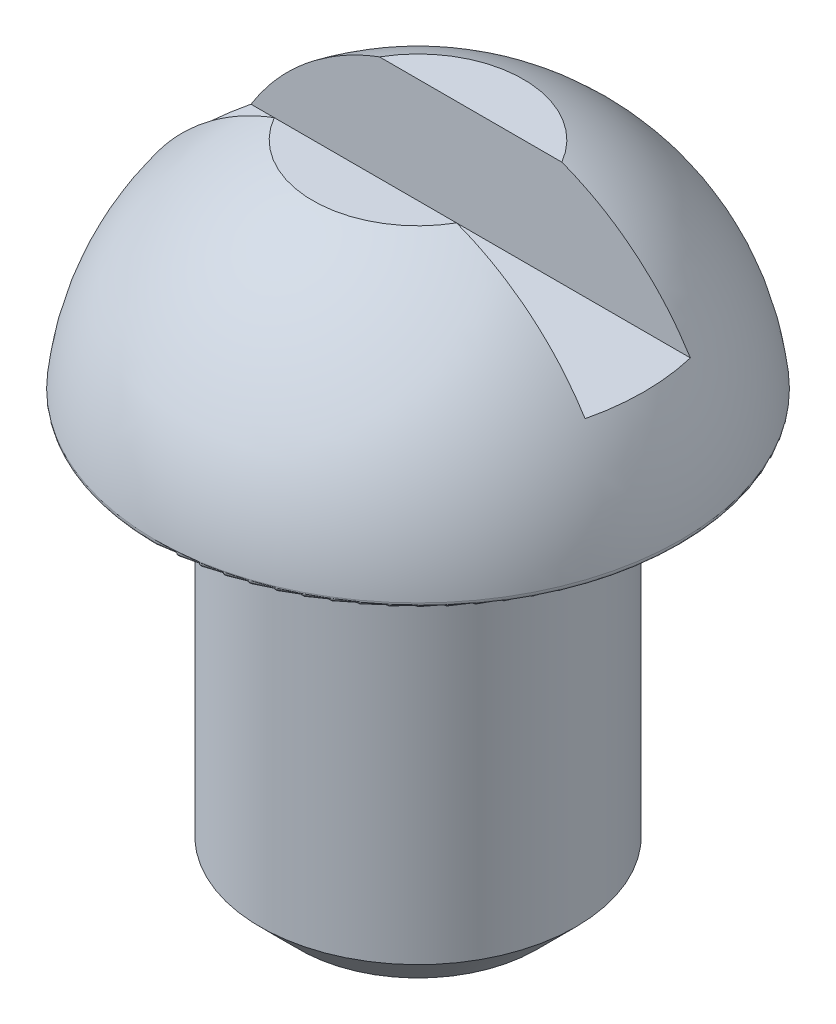
ISO-10303-21;
HEADER;
FILE_DESCRIPTION(('STEP AP214'),'2;1');
FILE_NAME('part.step','',(''),(''),'','','');
FILE_SCHEMA(('AUTOMOTIVE_DESIGN { 1 0 10303 214 1 1 1 1 }'));
ENDSEC;
DATA;
#1=APPLICATION_CONTEXT('core data for automotive mechanical design processes');
#2=APPLICATION_PROTOCOL_DEFINITION('international standard','automotive_design',2000,#1);
#3=PRODUCT_CONTEXT('',#1,'mechanical');
#4=PRODUCT('Part','Part','',(#3));
#5=PRODUCT_RELATED_PRODUCT_CATEGORY('part','',(#4));
#6=PRODUCT_DEFINITION_FORMATION('','',#4);
#7=PRODUCT_DEFINITION_CONTEXT('part definition',#1,'design');
#8=PRODUCT_DEFINITION('design','',#6,#7);
#9=PRODUCT_DEFINITION_SHAPE('','',#8);
#10=(LENGTH_UNIT() NAMED_UNIT(*) SI_UNIT(.MILLI.,.METRE.));
#11=(NAMED_UNIT(*) PLANE_ANGLE_UNIT() SI_UNIT($,.RADIAN.));
#12=(NAMED_UNIT(*) SI_UNIT($,.STERADIAN.) SOLID_ANGLE_UNIT());
#13=UNCERTAINTY_MEASURE_WITH_UNIT(LENGTH_MEASURE(1.E-05),#10,'distance_accuracy_value','');
#14=(GEOMETRIC_REPRESENTATION_CONTEXT(3) GLOBAL_UNCERTAINTY_ASSIGNED_CONTEXT((#13)) GLOBAL_UNIT_ASSIGNED_CONTEXT((#10,
#11,#12)) REPRESENTATION_CONTEXT('',''));
#15=CARTESIAN_POINT('',(0.,0.,0.));
#16=DIRECTION('',(0.,0.,1.));
#17=DIRECTION('',(1.,0.,0.));
#18=AXIS2_PLACEMENT_3D('',#15,#16,#17);
#19=CARTESIAN_POINT('',(0.,12.2,0.));
#20=DIRECTION('',(0.,1.,0.));
#21=DIRECTION('',(-1.,0.,0.));
#22=AXIS2_PLACEMENT_3D('',#19,#20,#21);
#23=PLANE('',#22);
#24=DIRECTION('',(-1.,0.,0.));
#25=VECTOR('',#24,1.);
#26=CARTESIAN_POINT('',(-5.,12.2,-0.999999999999999));
#27=LINE('',#26,#25);
#28=CARTESIAN_POINT('',(1.73205080756888,12.2,-1.));
#29=VERTEX_POINT('',#28);
#30=CARTESIAN_POINT('',(-1.73205080756888,12.2,-1.));
#31=VERTEX_POINT('',#30);
#32=EDGE_CURVE('E83',#29,#31,#27,.T.);
#33=ORIENTED_EDGE('',*,*,#32,.F.);
#34=CARTESIAN_POINT('',(0.,12.2,0.));
#35=DIRECTION('',(0.,-1.,0.));
#36=DIRECTION('',(1.,0.,0.));
#37=AXIS2_PLACEMENT_3D('',#34,#35,#36);
#38=CIRCLE('',#37,2.);
#39=EDGE_CURVE('E90',#31,#29,#38,.T.);
#40=ORIENTED_EDGE('',*,*,#39,.F.);
#41=EDGE_LOOP('',(#33,#40));
#42=FACE_BOUND('',#41,.T.);
#43=ADVANCED_FACE('F29',(#42),#23,.T.);
#44=CARTESIAN_POINT('',(2.25,0.,0.));
#45=DIRECTION('',(0.,-1.,0.));
#46=DIRECTION('',(1.,0.,0.));
#47=AXIS2_PLACEMENT_3D('',#44,#45,#46);
#48=PLANE('',#47);
#49=CARTESIAN_POINT('',(0.,0.,0.));
#50=DIRECTION('',(0.,-1.,0.));
#51=DIRECTION('',(1.,0.,0.));
#52=AXIS2_PLACEMENT_3D('',#49,#50,#51);
#53=CIRCLE('',#52,2.25);
#54=CARTESIAN_POINT('',(2.25,0.,0.));
#55=VERTEX_POINT('',#54);
#56=EDGE_CURVE('E188',#55,#55,#53,.T.);
#57=ORIENTED_EDGE('',*,*,#56,.T.);
#58=EDGE_LOOP('',(#57));
#59=FACE_BOUND('',#58,.T.);
#60=ADVANCED_FACE('F31',(#59),#48,.T.);
#61=DIRECTION('',(1.,0.,0.));
#62=VECTOR('',#61,1.);
#63=CARTESIAN_POINT('',(-5.,12.2,1.));
#64=LINE('',#63,#62);
#65=CARTESIAN_POINT('',(-1.73205080756888,12.2,1.));
#66=VERTEX_POINT('',#65);
#67=CARTESIAN_POINT('',(1.73205080756888,12.2,1.));
#68=VERTEX_POINT('',#67);
#69=EDGE_CURVE('E74',#66,#68,#64,.T.);
#70=ORIENTED_EDGE('',*,*,#69,.F.);
#71=EDGE_CURVE('E82',#68,#66,#38,.T.);
#72=ORIENTED_EDGE('',*,*,#71,.F.);
#73=EDGE_LOOP('',(#70,#72));
#74=FACE_BOUND('',#73,.T.);
#75=ADVANCED_FACE('F81',(#74),#23,.T.);
#76=CARTESIAN_POINT('',(0.,7.61083428716649,0.));
#77=DIRECTION('',(0.,-1.,0.));
#78=DIRECTION('',(1.,0.,0.));
#79=AXIS2_PLACEMENT_3D('',#76,#77,#78);
#80=DEGENERATE_TOROIDAL_SURFACE('',#79,0.0151680020330884,5.,.T.);
#81=CARTESIAN_POINT('',(0.,12.5128854839392,-1.));
#82=CARTESIAN_POINT('',(-0.169557181838723,12.5128939507586,-1.));
#83=CARTESIAN_POINT('',(-0.339026922754628,12.5042303683734,-1.));
#84=CARTESIAN_POINT('',(-0.676232944706971,12.469587223094,-1.));
#85=CARTESIAN_POINT('',(-0.843969405384313,12.443609473333,-1.));
#86=CARTESIAN_POINT('',(-1.14503973748901,12.3809247905035,-1.));
#87=CARTESIAN_POINT('',(-1.27898414052325,12.3471015058656,-1.));
#88=CARTESIAN_POINT('',(-1.54359706695251,12.2682883520842,-1.));
#89=CARTESIAN_POINT('',(-1.67426470696919,12.2232955066392,-1.));
#90=CARTESIAN_POINT('',(-1.93145983942588,12.1224070753553,-1.));
#91=CARTESIAN_POINT('',(-2.05798333215394,12.0665012991591,-1.));
#92=CARTESIAN_POINT('',(-2.30590425769781,11.9441838688712,-1.));
#93=CARTESIAN_POINT('',(-2.42729980449856,11.8777683912979,-1.));
#94=CARTESIAN_POINT('',(-2.66386390498333,11.7350265947615,-1.));
#95=CARTESIAN_POINT('',(-2.77904167957172,11.6587155564812,-1.));
#96=CARTESIAN_POINT('',(-3.00258835419661,11.496616229006,-1.));
#97=CARTESIAN_POINT('',(-3.11095472221317,11.4108244478177,-1.));
#98=CARTESIAN_POINT('',(-3.31999237594499,11.2304540196594,-1.));
#99=CARTESIAN_POINT('',(-3.42066839029364,11.1358808527463,-1.));
#100=CARTESIAN_POINT('',(-3.61371665053474,10.9385398711822,-1.));
#101=CARTESIAN_POINT('',(-3.70608581867615,10.8357690456295,-1.));
#102=CARTESIAN_POINT('',(-3.88163317168833,10.6230211503068,-1.));
#103=CARTESIAN_POINT('',(-3.96483031591958,10.5130597238344,-1.));
#104=CARTESIAN_POINT('',(-4.12169406138961,10.2864768923303,-1.));
#105=CARTESIAN_POINT('',(-4.1953571374636,10.1698530467513,-0.999999999999999));
#106=CARTESIAN_POINT('',(-4.33256893955827,9.93085247438629,-0.999999999999999));
#107=CARTESIAN_POINT('',(-4.39612108050007,9.80847770811316,-0.999999999999999));
#108=CARTESIAN_POINT('',(-4.51271059823116,9.55876293514372,-0.999999999999999));
#109=CARTESIAN_POINT('',(-4.56574408518139,9.43142111236505,-0.999999999999999));
#110=CARTESIAN_POINT('',(-4.6608583502784,9.17280334619384,-0.999999999999999));
#111=CARTESIAN_POINT('',(-4.70294618264055,9.04152999772286,-0.999999999999999));
#112=CARTESIAN_POINT('',(-4.77592913831986,8.77585946137168,-0.999999999999999));
#113=CARTESIAN_POINT('',(-4.80682013734069,8.64146114178254,-0.999999999999999));
#114=CARTESIAN_POINT('',(-4.85715548691062,8.37057397812446,-0.999999999999999));
#115=CARTESIAN_POINT('',(-4.87660391886644,8.23408589728932,-0.999999999999999));
#116=CARTESIAN_POINT('',(-4.90395054997721,7.95996096149684,-0.999999999999999));
#117=CARTESIAN_POINT('',(-4.91184473045493,7.82232372358325,-0.999999999999999));
#118=CARTESIAN_POINT('',(-4.91802226356671,7.40916631069517,-0.999999999999999));
#119=CARTESIAN_POINT('',(-4.89885761237477,7.13309256167962,-0.999999999999999));
#120=CARTESIAN_POINT('',(-4.83565436742556,6.72476061850118,-0.999999999999999));
#121=CARTESIAN_POINT('',(-4.80882062296754,6.58954321564015,-0.999999999999999));
#122=CARTESIAN_POINT('',(-4.74386614429401,6.32184348195945,-0.999999999999999));
#123=CARTESIAN_POINT('',(-4.70574933648759,6.18936021681104,-0.999999999999999));
#124=CARTESIAN_POINT('',(-4.61847741340263,5.92804317530176,-0.999999999999999));
#125=CARTESIAN_POINT('',(-4.56931842405602,5.79921069770116,-0.999999999999999));
#126=CARTESIAN_POINT('',(-4.4603405217531,5.54618852522655,-0.999999999999999));
#127=CARTESIAN_POINT('',(-4.40052553669696,5.42199713993968,-0.999999999999999));
#128=CARTESIAN_POINT('',(-4.27062373627063,5.17904823733273,-0.999999999999999));
#129=CARTESIAN_POINT('',(-4.20053303133169,5.06029280006442,-1.));
#130=CARTESIAN_POINT('',(-4.05062317272889,4.82915187999359,-1.));
#131=CARTESIAN_POINT('',(-3.97080761709885,4.7167640636875,-1.));
#132=CARTESIAN_POINT('',(-3.80195930460487,4.49906362558791,-1.));
#133=CARTESIAN_POINT('',(-3.71292266831044,4.3937540126641,-1.));
#134=CARTESIAN_POINT('',(-3.52632823913524,4.19104785471133,-1.));
#135=CARTESIAN_POINT('',(-3.42877360098011,4.09364840565467,-1.));
#136=CARTESIAN_POINT('',(-3.22577350395864,3.90737837719468,-1.));
#137=CARTESIAN_POINT('',(-3.12032532262769,3.81851076474733,-1.));
#138=CARTESIAN_POINT('',(-2.90235860909285,3.65000442793246,-1.));
#139=CARTESIAN_POINT('',(-2.78984269547053,3.57036231627658,-1.));
#140=CARTESIAN_POINT('',(-2.55843994385344,3.42079048724782,-1.));
#141=CARTESIAN_POINT('',(-2.43954952910376,3.35086630336972,-1.));
#142=CARTESIAN_POINT('',(-2.19634782163876,3.22130151635402,-1.));
#143=CARTESIAN_POINT('',(-2.07203852883527,3.16165715889591,-1.));
#144=CARTESIAN_POINT('',(-1.81879741538758,3.05301960807788,-1.));
#145=CARTESIAN_POINT('',(-1.68986399240107,3.00403014919028,-1.));
#146=CARTESIAN_POINT('',(-1.42838328787875,2.91708068518244,-1.));
#147=CARTESIAN_POINT('',(-1.29583725312695,2.87911692630204,-1.));
#148=CARTESIAN_POINT('',(-1.02784924149484,2.81440529649992,-1.));
#149=CARTESIAN_POINT('',(-0.892403899354288,2.78767129519316,-1.));
#150=CARTESIAN_POINT('',(-0.619801709020969,2.74563108957768,-1.));
#151=CARTESIAN_POINT('',(-0.482644833082193,2.73032507077552,-1.));
#152=CARTESIAN_POINT('',(-0.0699016829823741,2.70164038620068,-1.));
#153=CARTESIAN_POINT('',(0.20716397415529,2.70544551583172,-1.));
#154=CARTESIAN_POINT('',(0.620379379138507,2.74566316283544,-1.));
#155=CARTESIAN_POINT('',(0.758468614696081,2.76502290866257,-1.));
#156=CARTESIAN_POINT('',(1.03256411441096,2.81537138726886,-1.));
#157=CARTESIAN_POINT('',(1.16857038348469,2.84636009259579,-1.));
#158=CARTESIAN_POINT('',(1.4374068755828,2.91976678285834,-1.));
#159=CARTESIAN_POINT('',(1.57023800699988,2.96218145521508,-1.));
#160=CARTESIAN_POINT('',(1.83186170670425,3.05817009990378,-1.));
#161=CARTESIAN_POINT('',(1.96065286418966,3.11174792169284,-1.));
#162=CARTESIAN_POINT('',(2.21229233681948,3.22924686533416,-1.));
#163=CARTESIAN_POINT('',(2.33517686427824,3.29309046479403,-1.));
#164=CARTESIAN_POINT('',(2.57515245823515,3.43096495025261,-1.));
#165=CARTESIAN_POINT('',(2.69224137702679,3.5049995749264,-1.));
#166=CARTESIAN_POINT('',(2.91969880763679,3.66268420268561,-1.));
#167=CARTESIAN_POINT('',(3.03006947507509,3.74633109643279,-1.));
#168=CARTESIAN_POINT('',(3.24337902106771,3.92269417177599,-1.));
#169=CARTESIAN_POINT('',(3.34631514273422,4.01541368798573,-1.));
#170=CARTESIAN_POINT('',(3.5435342903974,4.20880308391267,-1.));
#171=CARTESIAN_POINT('',(3.63785352683289,4.30943604020577,-1.));
#172=CARTESIAN_POINT('',(3.81771019829952,4.5183302666773,-1.));
#173=CARTESIAN_POINT('',(3.90324438972962,4.62659432970036,-1.));
#174=CARTESIAN_POINT('',(4.06484937250135,4.84990253862764,-1.));
#175=CARTESIAN_POINT('',(4.14092395067599,4.96494394409685,-1.));
#176=CARTESIAN_POINT('',(4.2831346846115,5.20107161610248,-1.));
#177=CARTESIAN_POINT('',(4.34926716186651,5.32216009804703,-1.));
#178=CARTESIAN_POINT('',(4.4710401913687,5.56938277251147,-1.));
#179=CARTESIAN_POINT('',(4.526689085618,5.69551285561383,-1.));
#180=CARTESIAN_POINT('',(4.62718349389348,5.95205697074383,-1.));
#181=CARTESIAN_POINT('',(4.67202501296511,6.08247256673404,-1.));
#182=CARTESIAN_POINT('',(4.75054378634992,6.34658087414781,-1.));
#183=CARTESIAN_POINT('',(4.78422507811644,6.48027238160034,-1.));
#184=CARTESIAN_POINT('',(4.84022012367806,6.75002898012544,-1.));
#185=CARTESIAN_POINT('',(4.86252967611517,6.88609492927619,-1.));
#186=CARTESIAN_POINT('',(4.91208198208369,7.29628008038227,-1.));
#187=CARTESIAN_POINT('',(4.92204141540977,7.57270055686264,-1.));
#188=CARTESIAN_POINT('',(4.89539813305126,8.12313952361221,-1.));
#189=CARTESIAN_POINT('',(4.85879540943576,8.39715801347226,-1.));
#190=CARTESIAN_POINT('',(4.74010972492546,8.9351957443902,-1.));
#191=CARTESIAN_POINT('',(4.65802761149768,9.1992151716736,-1.));
#192=CARTESIAN_POINT('',(4.45070358586524,9.70971602398544,-1.));
#193=CARTESIAN_POINT('',(4.32546166169026,9.95619744414973,-1.));
#194=CARTESIAN_POINT('',(4.0353708543484,10.4246512364068,-1.));
#195=CARTESIAN_POINT('',(3.87052011467672,10.6466224589701,-1.));
#196=CARTESIAN_POINT('',(3.50590273785951,11.0597331988992,-1.));
#197=CARTESIAN_POINT('',(3.30613738081084,11.2508738461322,-1.));
#198=CARTESIAN_POINT('',(2.87735818710065,11.5969184625164,-1.));
#199=CARTESIAN_POINT('',(2.6483439342984,11.7518219160117,-1.));
#200=CARTESIAN_POINT('',(2.16751167269192,12.0210452383048,-1.));
#201=CARTESIAN_POINT('',(1.91568787167098,12.1353547622846,-1.));
#202=CARTESIAN_POINT('',(1.39078385021158,12.3221578239191,-1.));
#203=CARTESIAN_POINT('',(1.11735957991674,12.3936839141624,-1.));
#204=CARTESIAN_POINT('',(0.562537309292827,12.4890144144784,-1.));
#205=CARTESIAN_POINT('',(0.281148449311643,12.512871444822,-1.));
#206=CARTESIAN_POINT('',(0.,12.5128854839392,-1.));
#207=B_SPLINE_CURVE_WITH_KNOTS('',3,(#81,#82,#83,#84,#85,#86,#87,#88,#89,#90,#91,#92,#93,#94,
#95,#96,#97,#98,#99,#100,#101,#102,#103,#104,#105,#106,#107,#108,#109,#110,#111,#112,#113,#114,
#115,#116,#117,#118,#119,#120,#121,#122,#123,#124,#125,#126,#127,#128,#129,#130,#131,#132,#133,
#134,#135,#136,#137,#138,#139,#140,#141,#142,#143,#144,#145,#146,#147,#148,#149,#150,#151,#152,
#153,#154,#155,#156,#157,#158,#159,#160,#161,#162,#163,#164,#165,#166,#167,#168,#169,#170,#171,
#172,#173,#174,#175,#176,#177,#178,#179,#180,#181,#182,#183,#184,#185,#186,#187,#188,#189,#190,
#191,#192,#193,#194,#195,#196,#197,#198,#199,#200,#201,#202,#203,#204,#205,#206),.UNSPECIFIED.,
.T.,.F.,(4,2,2,2,2,2,2,2,2,2,2,2,2,2,2,2,2,2,2,2,2,2,2,2,2,2,2,2,2,2,2,2,2,2,2,2,2,2,2,2,2,2,2,
2,2,2,2,2,2,2,2,2,2,2,2,2,2,2,2,2,2,2,4),(0.,0.508303007015323,1.01655279309027,
1.43053511928802,1.84462787608033,2.25910917334688,2.67374160911585,3.08774123056177,
3.50189384982177,3.9157897306988,4.32983833680059,4.74301435305338,5.15634270488183,
5.5695311592685,5.9828721286181,6.39594604562871,6.80917196205233,7.22225039696368,
7.63547247032325,8.46098855709147,8.87418318086761,9.28723418516442,9.70043033234164,
10.1134744854944,10.5266753898605,10.9397238783276,11.3529468531714,11.7660174307608,
12.1792311377209,12.5922926425908,13.0055883939184,13.4187328831722,13.8320219443457,
14.245170133598,14.6588271029137,15.0724907868365,15.8991874518347,16.3171292348522,
16.7350700312501,17.1528897897835,17.5708538668281,17.9857983318554,18.400895430956,
18.8158586320898,19.2309749286601,19.6442577644289,20.0576926474273,20.4709614894003,
20.8843828635328,21.2974738672929,21.7107173370604,22.1238111434312,22.5370574593908,
23.3625800851532,24.1881028515267,25.0136102355526,25.8391178485319,26.6646641614291,
27.4901802131426,28.3157080112527,29.1414460333295,29.9852122160073,30.828046477895),.UNSPECIFIED.);
#208=CARTESIAN_POINT('',(-4.17447127817742,10.2,-0.999999999999999));
#209=VERTEX_POINT('',#208);
#210=EDGE_CURVE('E11',#31,#209,#207,.T.);
#211=ORIENTED_EDGE('',*,*,#210,.F.);
#212=ORIENTED_EDGE('',*,*,#39,.T.);
#213=CARTESIAN_POINT('',(4.17447127817742,10.2,-1.));
#214=VERTEX_POINT('',#213);
#215=EDGE_CURVE('E33',#214,#29,#207,.T.);
#216=ORIENTED_EDGE('',*,*,#215,.F.);
#217=CARTESIAN_POINT('',(0.,10.2,0.));
#218=DIRECTION('',(0.,1.,0.));
#219=DIRECTION('',(0.,0.,1.));
#220=AXIS2_PLACEMENT_3D('',#217,#218,#219);
#221=CIRCLE('',#220,4.2925762022739);
#222=CARTESIAN_POINT('',(4.17447127817742,10.2,0.999999999999999));
#223=VERTEX_POINT('',#222);
#224=EDGE_CURVE('E102',#214,#223,#221,.F.);
#225=ORIENTED_EDGE('',*,*,#224,.T.);
#226=CARTESIAN_POINT('',(0.,12.5128854839392,1.));
#227=CARTESIAN_POINT('',(0.169557181838723,12.5128939507586,1.));
#228=CARTESIAN_POINT('',(0.339026922754628,12.5042303683734,1.));
#229=CARTESIAN_POINT('',(0.676232944706971,12.469587223094,1.));
#230=CARTESIAN_POINT('',(0.843969405384313,12.443609473333,1.));
#231=CARTESIAN_POINT('',(1.14503973748901,12.3809247905035,1.));
#232=CARTESIAN_POINT('',(1.27898414052325,12.3471015058656,1.));
#233=CARTESIAN_POINT('',(1.54359706695251,12.2682883520842,1.));
#234=CARTESIAN_POINT('',(1.67426470696919,12.2232955066392,1.));
#235=CARTESIAN_POINT('',(1.93145983942588,12.1224070753553,1.));
#236=CARTESIAN_POINT('',(2.05798333215394,12.0665012991591,1.));
#237=CARTESIAN_POINT('',(2.30590425769781,11.9441838688712,1.));
#238=CARTESIAN_POINT('',(2.42729980449856,11.8777683912979,1.));
#239=CARTESIAN_POINT('',(2.66386390498333,11.7350265947615,1.));
#240=CARTESIAN_POINT('',(2.77904167957172,11.6587155564812,1.));
#241=CARTESIAN_POINT('',(3.00258835419661,11.496616229006,1.));
#242=CARTESIAN_POINT('',(3.11095472221317,11.4108244478177,1.));
#243=CARTESIAN_POINT('',(3.31999237594499,11.2304540196594,1.));
#244=CARTESIAN_POINT('',(3.42066839029364,11.1358808527463,1.));
#245=CARTESIAN_POINT('',(3.61371665053474,10.9385398711822,1.));
#246=CARTESIAN_POINT('',(3.70608581867615,10.8357690456295,1.));
#247=CARTESIAN_POINT('',(3.88163317168833,10.6230211503068,1.));
#248=CARTESIAN_POINT('',(3.96483031591958,10.5130597238344,1.));
#249=CARTESIAN_POINT('',(4.12169406138961,10.2864768923303,1.));
#250=CARTESIAN_POINT('',(4.1953571374636,10.1698530467513,0.999999999999999));
#251=CARTESIAN_POINT('',(4.33256893955827,9.93085247438629,0.999999999999999));
#252=CARTESIAN_POINT('',(4.39612108050007,9.80847770811316,0.999999999999999));
#253=CARTESIAN_POINT('',(4.51271059823116,9.55876293514372,0.999999999999999));
#254=CARTESIAN_POINT('',(4.56574408518139,9.43142111236505,0.999999999999999));
#255=CARTESIAN_POINT('',(4.6608583502784,9.17280334619384,0.999999999999999));
#256=CARTESIAN_POINT('',(4.70294618264055,9.04152999772286,0.999999999999999));
#257=CARTESIAN_POINT('',(4.77592913831986,8.77585946137168,0.999999999999999));
#258=CARTESIAN_POINT('',(4.80682013734069,8.64146114178254,0.999999999999999));
#259=CARTESIAN_POINT('',(4.85715548691062,8.37057397812446,0.999999999999999));
#260=CARTESIAN_POINT('',(4.87660391886644,8.23408589728932,0.999999999999999));
#261=CARTESIAN_POINT('',(4.90395054997721,7.95996096149684,0.999999999999999));
#262=CARTESIAN_POINT('',(4.91184473045493,7.82232372358325,0.999999999999999));
#263=CARTESIAN_POINT('',(4.91802226356671,7.40916631069517,0.999999999999999));
#264=CARTESIAN_POINT('',(4.89885761237477,7.13309256167962,0.999999999999999));
#265=CARTESIAN_POINT('',(4.83565436742556,6.72476061850118,0.999999999999999));
#266=CARTESIAN_POINT('',(4.80882062296754,6.58954321564015,0.999999999999999));
#267=CARTESIAN_POINT('',(4.74386614429401,6.32184348195945,0.999999999999999));
#268=CARTESIAN_POINT('',(4.70574933648759,6.18936021681104,0.999999999999999));
#269=CARTESIAN_POINT('',(4.61847741340263,5.92804317530176,0.999999999999999));
#270=CARTESIAN_POINT('',(4.56931842405602,5.79921069770116,0.999999999999999));
#271=CARTESIAN_POINT('',(4.4603405217531,5.54618852522655,0.999999999999999));
#272=CARTESIAN_POINT('',(4.40052553669696,5.42199713993968,0.999999999999999));
#273=CARTESIAN_POINT('',(4.27062373627063,5.17904823733273,0.999999999999999));
#274=CARTESIAN_POINT('',(4.20053303133169,5.06029280006442,1.));
#275=CARTESIAN_POINT('',(4.05062317272889,4.82915187999359,1.));
#276=CARTESIAN_POINT('',(3.97080761709885,4.7167640636875,1.));
#277=CARTESIAN_POINT('',(3.80195930460487,4.49906362558791,1.));
#278=CARTESIAN_POINT('',(3.71292266831044,4.3937540126641,1.));
#279=CARTESIAN_POINT('',(3.52632823913524,4.19104785471133,1.));
#280=CARTESIAN_POINT('',(3.42877360098011,4.09364840565467,1.));
#281=CARTESIAN_POINT('',(3.22577350395864,3.90737837719468,1.));
#282=CARTESIAN_POINT('',(3.12032532262769,3.81851076474733,1.));
#283=CARTESIAN_POINT('',(2.90235860909285,3.65000442793246,1.));
#284=CARTESIAN_POINT('',(2.78984269547053,3.57036231627658,1.));
#285=CARTESIAN_POINT('',(2.55843994385344,3.42079048724782,1.));
#286=CARTESIAN_POINT('',(2.43954952910376,3.35086630336972,1.));
#287=CARTESIAN_POINT('',(2.19634782163876,3.22130151635402,1.));
#288=CARTESIAN_POINT('',(2.07203852883527,3.16165715889591,1.));
#289=CARTESIAN_POINT('',(1.81879741538758,3.05301960807788,1.));
#290=CARTESIAN_POINT('',(1.68986399240107,3.00403014919028,1.));
#291=CARTESIAN_POINT('',(1.42838328787875,2.91708068518244,1.));
#292=CARTESIAN_POINT('',(1.29583725312695,2.87911692630204,1.));
#293=CARTESIAN_POINT('',(1.02784924149484,2.81440529649992,1.));
#294=CARTESIAN_POINT('',(0.892403899354288,2.78767129519316,1.));
#295=CARTESIAN_POINT('',(0.619801709020969,2.74563108957768,1.));
#296=CARTESIAN_POINT('',(0.482644833082193,2.73032507077552,1.));
#297=CARTESIAN_POINT('',(0.0699016829823741,2.70164038620068,1.));
#298=CARTESIAN_POINT('',(-0.20716397415529,2.70544551583172,1.));
#299=CARTESIAN_POINT('',(-0.620379379138507,2.74566316283544,1.));
#300=CARTESIAN_POINT('',(-0.758468614696081,2.76502290866257,1.));
#301=CARTESIAN_POINT('',(-1.03256411441096,2.81537138726886,1.));
#302=CARTESIAN_POINT('',(-1.16857038348469,2.84636009259579,1.));
#303=CARTESIAN_POINT('',(-1.4374068755828,2.91976678285834,1.));
#304=CARTESIAN_POINT('',(-1.57023800699988,2.96218145521508,1.));
#305=CARTESIAN_POINT('',(-1.83186170670425,3.05817009990378,1.));
#306=CARTESIAN_POINT('',(-1.96065286418966,3.11174792169284,1.));
#307=CARTESIAN_POINT('',(-2.21229233681948,3.22924686533416,1.));
#308=CARTESIAN_POINT('',(-2.33517686427824,3.29309046479403,1.));
#309=CARTESIAN_POINT('',(-2.57515245823515,3.43096495025261,1.));
#310=CARTESIAN_POINT('',(-2.69224137702679,3.5049995749264,1.));
#311=CARTESIAN_POINT('',(-2.91969880763679,3.66268420268561,1.));
#312=CARTESIAN_POINT('',(-3.03006947507509,3.74633109643279,1.));
#313=CARTESIAN_POINT('',(-3.24337902106771,3.92269417177599,1.));
#314=CARTESIAN_POINT('',(-3.34631514273422,4.01541368798573,1.));
#315=CARTESIAN_POINT('',(-3.5435342903974,4.20880308391267,1.));
#316=CARTESIAN_POINT('',(-3.63785352683289,4.30943604020577,1.));
#317=CARTESIAN_POINT('',(-3.81771019829952,4.5183302666773,1.));
#318=CARTESIAN_POINT('',(-3.90324438972962,4.62659432970036,1.));
#319=CARTESIAN_POINT('',(-4.06484937250135,4.84990253862764,1.));
#320=CARTESIAN_POINT('',(-4.14092395067599,4.96494394409685,1.));
#321=CARTESIAN_POINT('',(-4.2831346846115,5.20107161610248,1.));
#322=CARTESIAN_POINT('',(-4.34926716186651,5.32216009804703,1.));
#323=CARTESIAN_POINT('',(-4.4710401913687,5.56938277251147,1.));
#324=CARTESIAN_POINT('',(-4.526689085618,5.69551285561383,1.));
#325=CARTESIAN_POINT('',(-4.62718349389348,5.95205697074383,1.));
#326=CARTESIAN_POINT('',(-4.67202501296511,6.08247256673404,1.));
#327=CARTESIAN_POINT('',(-4.75054378634992,6.34658087414781,1.));
#328=CARTESIAN_POINT('',(-4.78422507811644,6.48027238160034,1.));
#329=CARTESIAN_POINT('',(-4.84022012367806,6.75002898012544,1.));
#330=CARTESIAN_POINT('',(-4.86252967611517,6.88609492927619,1.));
#331=CARTESIAN_POINT('',(-4.91208198208369,7.29628008038227,1.));
#332=CARTESIAN_POINT('',(-4.92204141540977,7.57270055686264,1.));
#333=CARTESIAN_POINT('',(-4.89539813305126,8.12313952361221,1.));
#334=CARTESIAN_POINT('',(-4.85879540943576,8.39715801347226,1.));
#335=CARTESIAN_POINT('',(-4.74010972492546,8.9351957443902,1.));
#336=CARTESIAN_POINT('',(-4.65802761149768,9.1992151716736,1.));
#337=CARTESIAN_POINT('',(-4.45070358586524,9.70971602398544,1.));
#338=CARTESIAN_POINT('',(-4.32546166169026,9.95619744414973,1.));
#339=CARTESIAN_POINT('',(-4.0353708543484,10.4246512364068,1.));
#340=CARTESIAN_POINT('',(-3.87052011467672,10.6466224589701,1.));
#341=CARTESIAN_POINT('',(-3.50590273785951,11.0597331988992,1.));
#342=CARTESIAN_POINT('',(-3.30613738081084,11.2508738461322,1.));
#343=CARTESIAN_POINT('',(-2.87735818710065,11.5969184625164,1.));
#344=CARTESIAN_POINT('',(-2.6483439342984,11.7518219160117,1.));
#345=CARTESIAN_POINT('',(-2.16751167269192,12.0210452383048,1.));
#346=CARTESIAN_POINT('',(-1.91568787167098,12.1353547622846,1.));
#347=CARTESIAN_POINT('',(-1.39078385021158,12.3221578239191,1.));
#348=CARTESIAN_POINT('',(-1.11735957991674,12.3936839141624,1.));
#349=CARTESIAN_POINT('',(-0.562537309292827,12.4890144144784,1.));
#350=CARTESIAN_POINT('',(-0.281148449311643,12.512871444822,1.));
#351=CARTESIAN_POINT('',(0.,12.5128854839392,1.));
#352=B_SPLINE_CURVE_WITH_KNOTS('',3,(#226,#227,#228,#229,#230,#231,#232,#233,#234,#235,#236,
#237,#238,#239,#240,#241,#242,#243,#244,#245,#246,#247,#248,#249,#250,#251,#252,#253,#254,#255,
#256,#257,#258,#259,#260,#261,#262,#263,#264,#265,#266,#267,#268,#269,#270,#271,#272,#273,#274,
#275,#276,#277,#278,#279,#280,#281,#282,#283,#284,#285,#286,#287,#288,#289,#290,#291,#292,#293,
#294,#295,#296,#297,#298,#299,#300,#301,#302,#303,#304,#305,#306,#307,#308,#309,#310,#311,#312,
#313,#314,#315,#316,#317,#318,#319,#320,#321,#322,#323,#324,#325,#326,#327,#328,#329,#330,#331,
#332,#333,#334,#335,#336,#337,#338,#339,#340,#341,#342,#343,#344,#345,#346,#347,#348,#349,#350,
#351),.UNSPECIFIED.,.T.,.F.,(4,2,2,2,2,2,2,2,2,2,2,2,2,2,2,2,2,2,2,2,2,2,2,2,2,2,2,2,2,2,2,2,2,
2,2,2,2,2,2,2,2,2,2,2,2,2,2,2,2,2,2,2,2,2,2,2,2,2,2,2,2,2,4),(0.,0.508303007015323,
1.01655279309027,1.43053511928802,1.84462787608033,2.25910917334688,2.67374160911585,
3.08774123056177,3.50189384982177,3.9157897306988,4.32983833680059,4.74301435305338,
5.15634270488183,5.5695311592685,5.9828721286181,6.39594604562871,6.80917196205233,
7.22225039696368,7.63547247032325,8.46098855709147,8.87418318086761,9.28723418516442,
9.70043033234164,10.1134744854944,10.5266753898605,10.9397238783276,11.3529468531714,
11.7660174307608,12.1792311377209,12.5922926425908,13.0055883939184,13.4187328831722,
13.8320219443457,14.245170133598,14.6588271029137,15.0724907868365,15.8991874518347,
16.3171292348522,16.7350700312501,17.1528897897835,17.5708538668281,17.9857983318554,
18.400895430956,18.8158586320898,19.2309749286601,19.6442577644289,20.0576926474273,
20.4709614894003,20.8843828635328,21.2974738672929,21.7107173370604,22.1238111434312,
22.5370574593908,23.3625800851532,24.1881028515267,25.0136102355526,25.8391178485319,
26.6646641614291,27.4901802131426,28.3157080112527,29.1414460333295,29.9852122160073,
30.828046477895),.UNSPECIFIED.);
#353=EDGE_CURVE('E78',#68,#223,#352,.T.);
#354=ORIENTED_EDGE('',*,*,#353,.F.);
#355=ORIENTED_EDGE('',*,*,#71,.T.);
#356=CARTESIAN_POINT('',(-4.17447127817742,10.2,1.));
#357=VERTEX_POINT('',#356);
#358=EDGE_CURVE('E42',#357,#66,#352,.T.);
#359=ORIENTED_EDGE('',*,*,#358,.F.);
#360=EDGE_CURVE('E54',#357,#209,#221,.F.);
#361=ORIENTED_EDGE('',*,*,#360,.T.);
#362=EDGE_LOOP('',(#211,#212,#216,#225,#354,#355,#359,#361));
#363=FACE_BOUND('',#362,.T.);
#364=CARTESIAN_POINT('',(0.,8.1099829737313,0.));
#365=DIRECTION('',(0.,-1.,0.));
#366=DIRECTION('',(1.,0.,0.));
#367=AXIS2_PLACEMENT_3D('',#364,#365,#366);
#368=CIRCLE('',#367,4.99019067421265);
#369=CARTESIAN_POINT('',(4.99019067421265,8.1099829737313,0.));
#370=VERTEX_POINT('',#369);
#371=EDGE_CURVE('E93',#370,#370,#368,.F.);
#372=ORIENTED_EDGE('',*,*,#371,.T.);
#373=EDGE_LOOP('',(#372));
#374=FACE_BOUND('',#373,.T.);
#375=ADVANCED_FACE('F86',(#363,#374),#80,.T.);
#376=CARTESIAN_POINT('',(5.,8.,0.));
#377=DIRECTION('',(0.,-1.,0.));
#378=DIRECTION('',(1.,0.,0.));
#379=AXIS2_PLACEMENT_3D('',#376,#377,#378);
#380=PLANE('',#379);
#381=CARTESIAN_POINT('',(0.,8.,0.));
#382=DIRECTION('',(0.,-1.,0.));
#383=DIRECTION('',(1.,0.,0.));
#384=AXIS2_PLACEMENT_3D('',#381,#382,#383);
#385=CIRCLE('',#384,4.89069022076906);
#386=CARTESIAN_POINT('',(4.89069022076906,8.,0.));
#387=VERTEX_POINT('',#386);
#388=EDGE_CURVE('E89',#387,#387,#385,.T.);
#389=ORIENTED_EDGE('',*,*,#388,.T.);
#390=EDGE_LOOP('',(#389));
#391=FACE_BOUND('',#390,.T.);
#392=CARTESIAN_POINT('',(0.,8.,0.));
#393=DIRECTION('',(0.,-1.,0.));
#394=DIRECTION('',(1.,0.,0.));
#395=AXIS2_PLACEMENT_3D('',#392,#393,#394);
#396=CIRCLE('',#395,3.);
#397=CARTESIAN_POINT('',(3.,8.,0.));
#398=VERTEX_POINT('',#397);
#399=EDGE_CURVE('E96',#398,#398,#396,.T.);
#400=ORIENTED_EDGE('',*,*,#399,.F.);
#401=EDGE_LOOP('',(#400));
#402=FACE_BOUND('',#401,.T.);
#403=ADVANCED_FACE('F125',(#391,#402),#380,.T.);
#404=CARTESIAN_POINT('',(0.,0.,0.));
#405=DIRECTION('',(0.,-1.,0.));
#406=DIRECTION('',(1.,0.,0.));
#407=AXIS2_PLACEMENT_3D('',#404,#405,#406);
#408=CYLINDRICAL_SURFACE('',#407,3.);
#409=ORIENTED_EDGE('',*,*,#399,.T.);
#410=EDGE_LOOP('',(#409));
#411=FACE_BOUND('',#410,.T.);
#412=CARTESIAN_POINT('',(0.,0.750000000000004,0.));
#413=DIRECTION('',(0.,-1.,0.));
#414=DIRECTION('',(1.,0.,0.));
#415=AXIS2_PLACEMENT_3D('',#412,#413,#414);
#416=CIRCLE('',#415,3.);
#417=CARTESIAN_POINT('',(3.,0.750000000000004,0.));
#418=VERTEX_POINT('',#417);
#419=EDGE_CURVE('E194',#418,#418,#416,.T.);
#420=ORIENTED_EDGE('',*,*,#419,.F.);
#421=EDGE_LOOP('',(#420));
#422=FACE_BOUND('',#421,.T.);
#423=ADVANCED_FACE('F122',(#411,#422),#408,.T.);
#424=CARTESIAN_POINT('',(0.,0.,0.));
#425=DIRECTION('',(0.,1.,0.));
#426=DIRECTION('',(-1.,0.,0.));
#427=AXIS2_PLACEMENT_3D('',#424,#425,#426);
#428=CONICAL_SURFACE('',#427,2.25,0.785398163397446);
#429=ORIENTED_EDGE('',*,*,#419,.T.);
#430=EDGE_LOOP('',(#429));
#431=FACE_BOUND('',#430,.T.);
#432=ORIENTED_EDGE('',*,*,#56,.F.);
#433=EDGE_LOOP('',(#432));
#434=FACE_BOUND('',#433,.T.);
#435=ADVANCED_FACE('F118',(#431,#434),#428,.T.);
#436=CARTESIAN_POINT('',(0.,8.1,0.));
#437=DIRECTION('',(0.,-1.,0.));
#438=DIRECTION('',(1.,0.,0.));
#439=AXIS2_PLACEMENT_3D('',#436,#437,#438);
#440=TOROIDAL_SURFACE('',#439,4.89069022076906,0.1);
#441=ORIENTED_EDGE('',*,*,#371,.F.);
#442=EDGE_LOOP('',(#441));
#443=FACE_BOUND('',#442,.T.);
#444=ORIENTED_EDGE('',*,*,#388,.F.);
#445=EDGE_LOOP('',(#444));
#446=FACE_BOUND('',#445,.T.);
#447=ADVANCED_FACE('F115',(#443,#446),#440,.T.);
#448=CARTESIAN_POINT('',(-5.,10.2,-0.999999999999999));
#449=DIRECTION('',(0.,0.,-1.));
#450=DIRECTION('',(-1.,0.,0.));
#451=AXIS2_PLACEMENT_3D('',#448,#449,#450);
#452=PLANE('',#451);
#453=ORIENTED_EDGE('',*,*,#210,.T.);
#454=DIRECTION('',(-1.,0.,0.));
#455=VECTOR('',#454,1.);
#456=CARTESIAN_POINT('',(-5.,10.2,-0.999999999999999));
#457=LINE('',#456,#455);
#458=EDGE_CURVE('E185',#214,#209,#457,.T.);
#459=ORIENTED_EDGE('',*,*,#458,.F.);
#460=ORIENTED_EDGE('',*,*,#215,.T.);
#461=ORIENTED_EDGE('',*,*,#32,.T.);
#462=EDGE_LOOP('',(#453,#459,#460,#461));
#463=FACE_BOUND('',#462,.T.);
#464=ADVANCED_FACE('F112',(#463),#452,.F.);
#465=CARTESIAN_POINT('',(-5.,10.2,1.));
#466=DIRECTION('',(0.,0.,1.));
#467=DIRECTION('',(1.,0.,0.));
#468=AXIS2_PLACEMENT_3D('',#465,#466,#467);
#469=PLANE('',#468);
#470=ORIENTED_EDGE('',*,*,#353,.T.);
#471=DIRECTION('',(1.,0.,0.));
#472=VECTOR('',#471,1.);
#473=CARTESIAN_POINT('',(-5.,10.2,1.));
#474=LINE('',#473,#472);
#475=EDGE_CURVE('E49',#357,#223,#474,.T.);
#476=ORIENTED_EDGE('',*,*,#475,.F.);
#477=ORIENTED_EDGE('',*,*,#358,.T.);
#478=ORIENTED_EDGE('',*,*,#69,.T.);
#479=EDGE_LOOP('',(#470,#476,#477,#478));
#480=FACE_BOUND('',#479,.T.);
#481=ADVANCED_FACE('F73',(#480),#469,.F.);
#482=CARTESIAN_POINT('',(-5.,10.2,1.));
#483=DIRECTION('',(0.,1.,0.));
#484=DIRECTION('',(0.,0.,1.));
#485=AXIS2_PLACEMENT_3D('',#482,#483,#484);
#486=PLANE('',#485);
#487=ORIENTED_EDGE('',*,*,#475,.T.);
#488=ORIENTED_EDGE('',*,*,#224,.F.);
#489=ORIENTED_EDGE('',*,*,#458,.T.);
#490=ORIENTED_EDGE('',*,*,#360,.F.);
#491=EDGE_LOOP('',(#487,#488,#489,#490));
#492=FACE_BOUND('',#491,.T.);
#493=ADVANCED_FACE('F111',(#492),#486,.T.);
#494=CLOSED_SHELL('',(#43,#60,#75,#375,#403,#423,#435,#447,#464,#481,#493));
#495=MANIFOLD_SOLID_BREP('B2',#494);
#496=ADVANCED_BREP_SHAPE_REPRESENTATION('',(#18,#495),#14);
#497=SHAPE_DEFINITION_REPRESENTATION(#9,#496);
ENDSEC;
END-ISO-10303-21;
